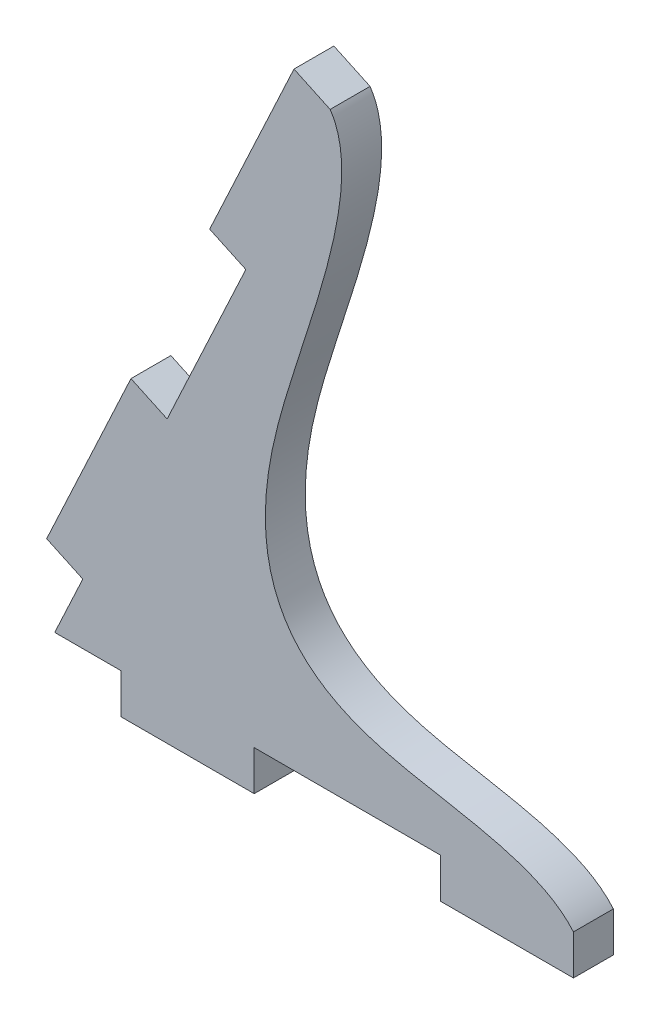
ISO-10303-21;
HEADER;
FILE_DESCRIPTION(('STEP AP214'),'2;1');
FILE_NAME('part.step','',(''),(''),'','','');
FILE_SCHEMA(('AUTOMOTIVE_DESIGN { 1 0 10303 214 1 1 1 1 }'));
ENDSEC;
DATA;
#1=APPLICATION_CONTEXT('core data for automotive mechanical design processes');
#2=APPLICATION_PROTOCOL_DEFINITION('international standard','automotive_design',2000,#1);
#3=PRODUCT_CONTEXT('',#1,'mechanical');
#4=PRODUCT('Part','Part','',(#3));
#5=PRODUCT_RELATED_PRODUCT_CATEGORY('part','',(#4));
#6=PRODUCT_DEFINITION_FORMATION('','',#4);
#7=PRODUCT_DEFINITION_CONTEXT('part definition',#1,'design');
#8=PRODUCT_DEFINITION('design','',#6,#7);
#9=PRODUCT_DEFINITION_SHAPE('','',#8);
#10=(LENGTH_UNIT() NAMED_UNIT(*) SI_UNIT(.MILLI.,.METRE.));
#11=(NAMED_UNIT(*) PLANE_ANGLE_UNIT() SI_UNIT($,.RADIAN.));
#12=(NAMED_UNIT(*) SI_UNIT($,.STERADIAN.) SOLID_ANGLE_UNIT());
#13=UNCERTAINTY_MEASURE_WITH_UNIT(LENGTH_MEASURE(1.E-05),#10,'distance_accuracy_value','');
#14=(GEOMETRIC_REPRESENTATION_CONTEXT(3) GLOBAL_UNCERTAINTY_ASSIGNED_CONTEXT((#13)) GLOBAL_UNIT_ASSIGNED_CONTEXT((#10,
#11,#12)) REPRESENTATION_CONTEXT('',''));
#15=CARTESIAN_POINT('',(0.,0.,0.));
#16=DIRECTION('',(0.,0.,1.));
#17=DIRECTION('',(1.,0.,0.));
#18=AXIS2_PLACEMENT_3D('',#15,#16,#17);
#19=CARTESIAN_POINT('',(0.,0.,3.));
#20=DIRECTION('',(0.,-1.,0.));
#21=DIRECTION('',(1.,0.,0.));
#22=AXIS2_PLACEMENT_3D('',#19,#20,#21);
#23=PLANE('',#22);
#24=DIRECTION('',(-1.,0.,0.));
#25=VECTOR('',#24,1.);
#26=CARTESIAN_POINT('',(0.,0.,0.));
#27=LINE('',#26,#25);
#28=CARTESIAN_POINT('',(29.,0.,0.));
#29=VERTEX_POINT('',#28);
#30=CARTESIAN_POINT('',(15.,0.,0.));
#31=VERTEX_POINT('',#30);
#32=EDGE_CURVE('E182',#29,#31,#27,.T.);
#33=ORIENTED_EDGE('',*,*,#32,.F.);
#34=DIRECTION('',(0.,0.,-1.));
#35=VECTOR('',#34,1.);
#36=CARTESIAN_POINT('',(29.,0.,3.));
#37=LINE('',#36,#35);
#38=CARTESIAN_POINT('',(29.,0.,3.));
#39=VERTEX_POINT('',#38);
#40=EDGE_CURVE('E11',#39,#29,#37,.T.);
#41=ORIENTED_EDGE('',*,*,#40,.F.);
#42=DIRECTION('',(-1.,0.,0.));
#43=VECTOR('',#42,1.);
#44=CARTESIAN_POINT('',(0.,0.,3.));
#45=LINE('',#44,#43);
#46=CARTESIAN_POINT('',(15.,0.,3.));
#47=VERTEX_POINT('',#46);
#48=EDGE_CURVE('E227',#39,#47,#45,.T.);
#49=ORIENTED_EDGE('',*,*,#48,.T.);
#50=DIRECTION('',(0.,0.,-1.));
#51=VECTOR('',#50,1.);
#52=CARTESIAN_POINT('',(15.,0.,3.));
#53=LINE('',#52,#51);
#54=EDGE_CURVE('E51',#47,#31,#53,.T.);
#55=ORIENTED_EDGE('',*,*,#54,.T.);
#56=EDGE_LOOP('',(#33,#41,#49,#55));
#57=FACE_BOUND('',#56,.T.);
#58=ADVANCED_FACE('F34',(#57),#23,.T.);
#59=CARTESIAN_POINT('',(29.,0.,3.));
#60=DIRECTION('',(1.,0.,0.));
#61=DIRECTION('',(0.,0.,-1.));
#62=AXIS2_PLACEMENT_3D('',#59,#60,#61);
#63=PLANE('',#62);
#64=DIRECTION('',(0.,-1.,0.));
#65=VECTOR('',#64,1.);
#66=CARTESIAN_POINT('',(29.,0.,0.));
#67=LINE('',#66,#65);
#68=CARTESIAN_POINT('',(29.,-3.,0.));
#69=VERTEX_POINT('',#68);
#70=EDGE_CURVE('E184',#29,#69,#67,.T.);
#71=ORIENTED_EDGE('',*,*,#70,.T.);
#72=DIRECTION('',(0.,0.,-1.));
#73=VECTOR('',#72,1.);
#74=CARTESIAN_POINT('',(29.,-3.,3.));
#75=LINE('',#74,#73);
#76=CARTESIAN_POINT('',(29.,-3.,3.));
#77=VERTEX_POINT('',#76);
#78=EDGE_CURVE('E43',#77,#69,#75,.T.);
#79=ORIENTED_EDGE('',*,*,#78,.F.);
#80=DIRECTION('',(0.,-1.,0.));
#81=VECTOR('',#80,1.);
#82=CARTESIAN_POINT('',(29.,0.,3.));
#83=LINE('',#82,#81);
#84=EDGE_CURVE('E275',#39,#77,#83,.T.);
#85=ORIENTED_EDGE('',*,*,#84,.F.);
#86=ORIENTED_EDGE('',*,*,#40,.T.);
#87=EDGE_LOOP('',(#71,#79,#85,#86));
#88=FACE_BOUND('',#87,.T.);
#89=ADVANCED_FACE('F36',(#88),#63,.F.);
#90=CARTESIAN_POINT('',(0.,-3.00000000000001,3.));
#91=DIRECTION('',(0.,-1.,0.));
#92=DIRECTION('',(1.,0.,0.));
#93=AXIS2_PLACEMENT_3D('',#90,#91,#92);
#94=PLANE('',#93);
#95=DIRECTION('',(-1.,0.,0.));
#96=VECTOR('',#95,1.);
#97=CARTESIAN_POINT('',(0.,-3.00000000000001,0.));
#98=LINE('',#97,#96);
#99=CARTESIAN_POINT('',(39.,-3.,0.));
#100=VERTEX_POINT('',#99);
#101=EDGE_CURVE('E188',#100,#69,#98,.T.);
#102=ORIENTED_EDGE('',*,*,#101,.F.);
#103=DIRECTION('',(0.,0.,-1.));
#104=VECTOR('',#103,1.);
#105=CARTESIAN_POINT('',(39.,-3.,3.));
#106=LINE('',#105,#104);
#107=CARTESIAN_POINT('',(39.,-3.,3.));
#108=VERTEX_POINT('',#107);
#109=EDGE_CURVE('E254',#108,#100,#106,.T.);
#110=ORIENTED_EDGE('',*,*,#109,.F.);
#111=DIRECTION('',(-1.,0.,0.));
#112=VECTOR('',#111,1.);
#113=CARTESIAN_POINT('',(0.,-3.00000000000001,3.));
#114=LINE('',#113,#112);
#115=EDGE_CURVE('E261',#108,#77,#114,.T.);
#116=ORIENTED_EDGE('',*,*,#115,.T.);
#117=ORIENTED_EDGE('',*,*,#78,.T.);
#118=EDGE_LOOP('',(#102,#110,#116,#117));
#119=FACE_BOUND('',#118,.T.);
#120=ADVANCED_FACE('F259',(#119),#94,.T.);
#121=CARTESIAN_POINT('',(39.,0.,3.));
#122=DIRECTION('',(1.,0.,0.));
#123=DIRECTION('',(0.,0.,-1.));
#124=AXIS2_PLACEMENT_3D('',#121,#122,#123);
#125=PLANE('',#124);
#126=DIRECTION('',(0.,-1.,0.));
#127=VECTOR('',#126,1.);
#128=CARTESIAN_POINT('',(39.,0.,0.));
#129=LINE('',#128,#127);
#130=CARTESIAN_POINT('',(39.,0.,0.));
#131=VERTEX_POINT('',#130);
#132=EDGE_CURVE('E191',#131,#100,#129,.T.);
#133=ORIENTED_EDGE('',*,*,#132,.F.);
#134=DIRECTION('',(0.,0.,-1.));
#135=VECTOR('',#134,1.);
#136=CARTESIAN_POINT('',(39.,0.,3.));
#137=LINE('',#136,#135);
#138=CARTESIAN_POINT('',(39.,0.,3.));
#139=VERTEX_POINT('',#138);
#140=EDGE_CURVE('E252',#139,#131,#137,.T.);
#141=ORIENTED_EDGE('',*,*,#140,.F.);
#142=DIRECTION('',(0.,-1.,0.));
#143=VECTOR('',#142,1.);
#144=CARTESIAN_POINT('',(39.,0.,3.));
#145=LINE('',#144,#143);
#146=EDGE_CURVE('E274',#139,#108,#145,.T.);
#147=ORIENTED_EDGE('',*,*,#146,.T.);
#148=ORIENTED_EDGE('',*,*,#109,.T.);
#149=EDGE_LOOP('',(#133,#141,#147,#148));
#150=FACE_BOUND('',#149,.T.);
#151=ADVANCED_FACE('F270',(#150),#125,.T.);
#152=CARTESIAN_POINT('',(39.,0.,3.));
#153=CARTESIAN_POINT('',(36.4021413195869,3.0880226090273,3.));
#154=CARTESIAN_POINT('',(28.2160980568506,3.51534273018984,3.));
#155=CARTESIAN_POINT('',(17.8173415493479,6.88339723514168,3.));
#156=CARTESIAN_POINT('',(14.4643975142389,12.4948591868415,3.));
#157=CARTESIAN_POINT('',(18.1111991055379,27.5080133750663,3.));
#158=CARTESIAN_POINT('',(23.3616026115048,40.5642627043672,3.));
#159=CARTESIAN_POINT('',(20.7082948252942,44.4090815647959,3.));
#160=B_SPLINE_CURVE_WITH_KNOTS('',3,(#152,#153,#154,#155,#156,#157,#158,#159),.UNSPECIFIED.,.F.,
.F.,(4,1,1,1,1,4),(0.,0.279353687679378,0.353115642968837,0.694896896236175,0.763857597605133,
1.),.UNSPECIFIED.);
#161=DIRECTION('',(0.,0.,-1.));
#162=VECTOR('',#161,1.);
#163=SURFACE_OF_LINEAR_EXTRUSION('',#160,#162);
#164=CARTESIAN_POINT('',(39.,0.,0.));
#165=CARTESIAN_POINT('',(36.4021413195869,3.0880226090273,0.));
#166=CARTESIAN_POINT('',(28.2160980568506,3.51534273018984,0.));
#167=CARTESIAN_POINT('',(17.8173415493479,6.88339723514168,0.));
#168=CARTESIAN_POINT('',(14.4643975142389,12.4948591868415,0.));
#169=CARTESIAN_POINT('',(18.1111991055379,27.5080133750663,0.));
#170=CARTESIAN_POINT('',(23.3616026115048,40.5642627043672,0.));
#171=CARTESIAN_POINT('',(20.7082948252942,44.4090815647959,0.));
#172=B_SPLINE_CURVE_WITH_KNOTS('',3,(#164,#165,#166,#167,#168,#169,#170,#171),.UNSPECIFIED.,.F.,
.F.,(4,1,1,1,1,4),(0.,0.279353687679378,0.353115642968837,0.694896896236175,0.763857597605133,
1.),.UNSPECIFIED.);
#173=CARTESIAN_POINT('',(20.7082948252942,44.4090815647959,0.));
#174=VERTEX_POINT('',#173);
#175=EDGE_CURVE('E194',#131,#174,#172,.T.);
#176=ORIENTED_EDGE('',*,*,#175,.T.);
#177=DIRECTION('',(0.,0.,-1.));
#178=VECTOR('',#177,1.);
#179=CARTESIAN_POINT('',(20.7082948252942,44.4090815647959,3.));
#180=LINE('',#179,#178);
#181=CARTESIAN_POINT('',(20.7082948252942,44.4090815647959,3.));
#182=VERTEX_POINT('',#181);
#183=EDGE_CURVE('E249',#182,#174,#180,.T.);
#184=ORIENTED_EDGE('',*,*,#183,.F.);
#185=EDGE_CURVE('E277',#139,#182,#160,.T.);
#186=ORIENTED_EDGE('',*,*,#185,.F.);
#187=ORIENTED_EDGE('',*,*,#140,.T.);
#188=EDGE_LOOP('',(#176,#184,#186,#187));
#189=FACE_BOUND('',#188,.T.);
#190=ADVANCED_FACE('F292',(#189),#163,.F.);
#191=CARTESIAN_POINT('',(20.7082948252942,44.4090815647959,3.));
#192=DIRECTION('',(-0.422618261740698,-0.906307787036651,0.));
#193=DIRECTION('',(0.906307787036651,-0.422618261740698,0.));
#194=AXIS2_PLACEMENT_3D('',#191,#192,#193);
#195=PLANE('',#194);
#196=DIRECTION('',(-0.906307787036651,0.422618261740698,0.));
#197=VECTOR('',#196,1.);
#198=CARTESIAN_POINT('',(20.7082948252942,44.4090815647959,0.));
#199=LINE('',#198,#197);
#200=CARTESIAN_POINT('',(17.9893714641842,45.676936350018,0.));
#201=VERTEX_POINT('',#200);
#202=EDGE_CURVE('E198',#174,#201,#199,.T.);
#203=ORIENTED_EDGE('',*,*,#202,.T.);
#204=DIRECTION('',(0.,0.,-1.));
#205=VECTOR('',#204,1.);
#206=CARTESIAN_POINT('',(17.9893714641842,45.676936350018,3.));
#207=LINE('',#206,#205);
#208=CARTESIAN_POINT('',(17.9893714641842,45.676936350018,3.));
#209=VERTEX_POINT('',#208);
#210=EDGE_CURVE('E246',#209,#201,#207,.T.);
#211=ORIENTED_EDGE('',*,*,#210,.F.);
#212=DIRECTION('',(-0.906307787036651,0.422618261740698,0.));
#213=VECTOR('',#212,1.);
#214=CARTESIAN_POINT('',(20.7082948252942,44.4090815647959,3.));
#215=LINE('',#214,#213);
#216=EDGE_CURVE('E286',#182,#209,#215,.T.);
#217=ORIENTED_EDGE('',*,*,#216,.F.);
#218=ORIENTED_EDGE('',*,*,#183,.T.);
#219=EDGE_LOOP('',(#203,#211,#217,#218));
#220=FACE_BOUND('',#219,.T.);
#221=ADVANCED_FACE('F296',(#220),#195,.F.);
#222=CARTESIAN_POINT('',(-2.71892336110996,1.26785478522209,3.));
#223=DIRECTION('',(0.906307787036651,-0.422618261740697,0.));
#224=DIRECTION('',(0.422618261740697,0.906307787036651,0.));
#225=AXIS2_PLACEMENT_3D('',#222,#223,#224);
#226=PLANE('',#225);
#227=DIRECTION('',(-0.422618261740697,-0.906307787036651,0.));
#228=VECTOR('',#227,1.);
#229=CARTESIAN_POINT('',(-2.71892336110996,1.26785478522209,0.));
#230=LINE('',#229,#228);
#231=CARTESIAN_POINT('',(11.6500975380737,32.0823195444682,0.));
#232=VERTEX_POINT('',#231);
#233=EDGE_CURVE('E203',#201,#232,#230,.T.);
#234=ORIENTED_EDGE('',*,*,#233,.T.);
#235=DIRECTION('',(0.,0.,-1.));
#236=VECTOR('',#235,1.);
#237=CARTESIAN_POINT('',(11.6500975380737,32.0823195444682,3.));
#238=LINE('',#237,#236);
#239=CARTESIAN_POINT('',(11.6500975380737,32.0823195444682,3.));
#240=VERTEX_POINT('',#239);
#241=EDGE_CURVE('E244',#240,#232,#238,.T.);
#242=ORIENTED_EDGE('',*,*,#241,.F.);
#243=DIRECTION('',(-0.422618261740697,-0.906307787036651,0.));
#244=VECTOR('',#243,1.);
#245=CARTESIAN_POINT('',(-2.71892336110996,1.26785478522209,3.));
#246=LINE('',#245,#244);
#247=EDGE_CURVE('E360',#209,#240,#246,.T.);
#248=ORIENTED_EDGE('',*,*,#247,.F.);
#249=ORIENTED_EDGE('',*,*,#210,.T.);
#250=EDGE_LOOP('',(#234,#242,#248,#249));
#251=FACE_BOUND('',#250,.T.);
#252=ADVANCED_FACE('F357',(#251),#226,.F.);
#253=CARTESIAN_POINT('',(14.3690208991837,30.8144647592461,3.));
#254=DIRECTION('',(-0.422618261740697,-0.906307787036651,0.));
#255=DIRECTION('',(0.906307787036651,-0.422618261740697,0.));
#256=AXIS2_PLACEMENT_3D('',#253,#254,#255);
#257=PLANE('',#256);
#258=DIRECTION('',(-0.906307787036651,0.422618261740697,0.));
#259=VECTOR('',#258,1.);
#260=CARTESIAN_POINT('',(14.3690208991837,30.8144647592461,0.));
#261=LINE('',#260,#259);
#262=CARTESIAN_POINT('',(14.3690208991837,30.8144647592462,0.));
#263=VERTEX_POINT('',#262);
#264=EDGE_CURVE('E206',#263,#232,#261,.T.);
#265=ORIENTED_EDGE('',*,*,#264,.F.);
#266=DIRECTION('',(0.,0.,-1.));
#267=VECTOR('',#266,1.);
#268=CARTESIAN_POINT('',(14.3690208991837,30.8144647592462,3.));
#269=LINE('',#268,#267);
#270=CARTESIAN_POINT('',(14.3690208991837,30.8144647592462,3.));
#271=VERTEX_POINT('',#270);
#272=EDGE_CURVE('E242',#271,#263,#269,.T.);
#273=ORIENTED_EDGE('',*,*,#272,.F.);
#274=DIRECTION('',(-0.906307787036651,0.422618261740697,0.));
#275=VECTOR('',#274,1.);
#276=CARTESIAN_POINT('',(14.3690208991837,30.8144647592461,3.));
#277=LINE('',#276,#275);
#278=EDGE_CURVE('E353',#271,#240,#277,.T.);
#279=ORIENTED_EDGE('',*,*,#278,.T.);
#280=ORIENTED_EDGE('',*,*,#241,.T.);
#281=EDGE_LOOP('',(#265,#273,#279,#280));
#282=FACE_BOUND('',#281,.T.);
#283=ADVANCED_FACE('F352',(#282),#257,.T.);
#284=CARTESIAN_POINT('',(0.,0.,3.));
#285=DIRECTION('',(0.906307787036651,-0.422618261740697,0.));
#286=DIRECTION('',(0.422618261740697,0.906307787036651,0.));
#287=AXIS2_PLACEMENT_3D('',#284,#285,#286);
#288=PLANE('',#287);
#289=DIRECTION('',(-0.422618261740697,-0.906307787036651,0.));
#290=VECTOR('',#289,1.);
#291=CARTESIAN_POINT('',(0.,0.,0.));
#292=LINE('',#291,#290);
#293=CARTESIAN_POINT('',(8.45236523481395,18.126155740733,0.));
#294=VERTEX_POINT('',#293);
#295=EDGE_CURVE('E209',#263,#294,#292,.T.);
#296=ORIENTED_EDGE('',*,*,#295,.T.);
#297=DIRECTION('',(0.,0.,-1.));
#298=VECTOR('',#297,1.);
#299=CARTESIAN_POINT('',(8.45236523481395,18.126155740733,3.));
#300=LINE('',#299,#298);
#301=CARTESIAN_POINT('',(8.45236523481395,18.126155740733,3.));
#302=VERTEX_POINT('',#301);
#303=EDGE_CURVE('E239',#302,#294,#300,.T.);
#304=ORIENTED_EDGE('',*,*,#303,.F.);
#305=DIRECTION('',(-0.422618261740697,-0.906307787036651,0.));
#306=VECTOR('',#305,1.);
#307=CARTESIAN_POINT('',(0.,0.,3.));
#308=LINE('',#307,#306);
#309=EDGE_CURVE('E348',#271,#302,#308,.T.);
#310=ORIENTED_EDGE('',*,*,#309,.F.);
#311=ORIENTED_EDGE('',*,*,#272,.T.);
#312=EDGE_LOOP('',(#296,#304,#310,#311));
#313=FACE_BOUND('',#312,.T.);
#314=ADVANCED_FACE('F320',(#313),#288,.F.);
#315=CARTESIAN_POINT('',(8.45236523481392,18.126155740733,3.));
#316=DIRECTION('',(-0.422618261740696,-0.906307787036651,0.));
#317=DIRECTION('',(0.906307787036652,-0.422618261740696,0.));
#318=AXIS2_PLACEMENT_3D('',#315,#316,#317);
#319=PLANE('',#318);
#320=DIRECTION('',(-0.906307787036652,0.422618261740696,0.));
#321=VECTOR('',#320,1.);
#322=CARTESIAN_POINT('',(8.45236523481392,18.126155740733,0.));
#323=LINE('',#322,#321);
#324=CARTESIAN_POINT('',(5.733441873704,19.3940105259551,0.));
#325=VERTEX_POINT('',#324);
#326=EDGE_CURVE('E211',#294,#325,#323,.T.);
#327=ORIENTED_EDGE('',*,*,#326,.T.);
#328=DIRECTION('',(0.,0.,-1.));
#329=VECTOR('',#328,1.);
#330=CARTESIAN_POINT('',(5.733441873704,19.3940105259551,3.));
#331=LINE('',#330,#329);
#332=CARTESIAN_POINT('',(5.733441873704,19.3940105259551,3.));
#333=VERTEX_POINT('',#332);
#334=EDGE_CURVE('E237',#333,#325,#331,.T.);
#335=ORIENTED_EDGE('',*,*,#334,.F.);
#336=DIRECTION('',(-0.906307787036652,0.422618261740696,0.));
#337=VECTOR('',#336,1.);
#338=CARTESIAN_POINT('',(8.45236523481392,18.126155740733,3.));
#339=LINE('',#338,#337);
#340=EDGE_CURVE('E345',#302,#333,#339,.T.);
#341=ORIENTED_EDGE('',*,*,#340,.F.);
#342=ORIENTED_EDGE('',*,*,#303,.T.);
#343=EDGE_LOOP('',(#327,#335,#341,#342));
#344=FACE_BOUND('',#343,.T.);
#345=ADVANCED_FACE('F342',(#344),#319,.F.);
#346=CARTESIAN_POINT('',(-2.71892336110994,1.26785478522209,3.));
#347=DIRECTION('',(-0.906307787036651,0.422618261740697,0.));
#348=DIRECTION('',(-0.422618261740697,-0.906307787036651,0.));
#349=AXIS2_PLACEMENT_3D('',#346,#347,#348);
#350=PLANE('',#349);
#351=DIRECTION('',(0.422618261740697,0.906307787036651,0.));
#352=VECTOR('',#351,1.);
#353=CARTESIAN_POINT('',(-2.71892336110994,1.26785478522209,0.));
#354=LINE('',#353,#352);
#355=CARTESIAN_POINT('',(-0.605832052406457,5.79939372040534,0.));
#356=VERTEX_POINT('',#355);
#357=EDGE_CURVE('E215',#356,#325,#354,.T.);
#358=ORIENTED_EDGE('',*,*,#357,.F.);
#359=DIRECTION('',(0.,0.,-1.));
#360=VECTOR('',#359,1.);
#361=CARTESIAN_POINT('',(-0.605832052406457,5.79939372040534,3.));
#362=LINE('',#361,#360);
#363=CARTESIAN_POINT('',(-0.605832052406457,5.79939372040534,3.));
#364=VERTEX_POINT('',#363);
#365=EDGE_CURVE('E235',#364,#356,#362,.T.);
#366=ORIENTED_EDGE('',*,*,#365,.F.);
#367=DIRECTION('',(0.422618261740697,0.906307787036651,0.));
#368=VECTOR('',#367,1.);
#369=CARTESIAN_POINT('',(-2.71892336110994,1.26785478522209,3.));
#370=LINE('',#369,#368);
#371=EDGE_CURVE('E369',#364,#333,#370,.T.);
#372=ORIENTED_EDGE('',*,*,#371,.T.);
#373=ORIENTED_EDGE('',*,*,#334,.T.);
#374=EDGE_LOOP('',(#358,#366,#372,#373));
#375=FACE_BOUND('',#374,.T.);
#376=ADVANCED_FACE('F336',(#375),#350,.T.);
#377=CARTESIAN_POINT('',(2.11309130870348,4.53153893518326,3.));
#378=DIRECTION('',(-0.422618261740697,-0.906307787036651,0.));
#379=DIRECTION('',(0.906307787036651,-0.422618261740697,0.));
#380=AXIS2_PLACEMENT_3D('',#377,#378,#379);
#381=PLANE('',#380);
#382=DIRECTION('',(-0.906307787036651,0.422618261740697,0.));
#383=VECTOR('',#382,1.);
#384=CARTESIAN_POINT('',(2.11309130870348,4.53153893518326,0.));
#385=LINE('',#384,#383);
#386=CARTESIAN_POINT('',(2.11309130870349,4.53153893518326,0.));
#387=VERTEX_POINT('',#386);
#388=EDGE_CURVE('E218',#387,#356,#385,.T.);
#389=ORIENTED_EDGE('',*,*,#388,.F.);
#390=DIRECTION('',(0.,0.,-1.));
#391=VECTOR('',#390,1.);
#392=CARTESIAN_POINT('',(2.11309130870349,4.53153893518326,3.));
#393=LINE('',#392,#391);
#394=CARTESIAN_POINT('',(2.11309130870349,4.53153893518326,3.));
#395=VERTEX_POINT('',#394);
#396=EDGE_CURVE('E233',#395,#387,#393,.T.);
#397=ORIENTED_EDGE('',*,*,#396,.F.);
#398=DIRECTION('',(-0.906307787036651,0.422618261740697,0.));
#399=VECTOR('',#398,1.);
#400=CARTESIAN_POINT('',(2.11309130870348,4.53153893518326,3.));
#401=LINE('',#400,#399);
#402=EDGE_CURVE('E332',#395,#364,#401,.T.);
#403=ORIENTED_EDGE('',*,*,#402,.T.);
#404=ORIENTED_EDGE('',*,*,#365,.T.);
#405=EDGE_LOOP('',(#389,#397,#403,#404));
#406=FACE_BOUND('',#405,.T.);
#407=ADVANCED_FACE('F318',(#406),#381,.T.);
#408=CARTESIAN_POINT('',(0.,0.,0.));
#409=VERTEX_POINT('',#408);
#410=EDGE_CURVE('E212',#387,#409,#292,.T.);
#411=ORIENTED_EDGE('',*,*,#410,.T.);
#412=DIRECTION('',(0.,0.,-1.));
#413=VECTOR('',#412,1.);
#414=CARTESIAN_POINT('',(0.,0.,3.));
#415=LINE('',#414,#413);
#416=CARTESIAN_POINT('',(0.,0.,3.));
#417=VERTEX_POINT('',#416);
#418=EDGE_CURVE('E231',#417,#409,#415,.T.);
#419=ORIENTED_EDGE('',*,*,#418,.F.);
#420=EDGE_CURVE('E367',#395,#417,#308,.T.);
#421=ORIENTED_EDGE('',*,*,#420,.F.);
#422=ORIENTED_EDGE('',*,*,#396,.T.);
#423=EDGE_LOOP('',(#411,#419,#421,#422));
#424=FACE_BOUND('',#423,.T.);
#425=ADVANCED_FACE('F312',(#424),#288,.F.);
#426=CARTESIAN_POINT('',(5.,0.,0.));
#427=VERTEX_POINT('',#426);
#428=EDGE_CURVE('E185',#427,#409,#27,.T.);
#429=ORIENTED_EDGE('',*,*,#428,.F.);
#430=DIRECTION('',(0.,0.,-1.));
#431=VECTOR('',#430,1.);
#432=CARTESIAN_POINT('',(5.,0.,3.));
#433=LINE('',#432,#431);
#434=CARTESIAN_POINT('',(5.,0.,3.));
#435=VERTEX_POINT('',#434);
#436=EDGE_CURVE('E174',#435,#427,#433,.T.);
#437=ORIENTED_EDGE('',*,*,#436,.F.);
#438=EDGE_CURVE('E164',#435,#417,#45,.T.);
#439=ORIENTED_EDGE('',*,*,#438,.T.);
#440=ORIENTED_EDGE('',*,*,#418,.T.);
#441=EDGE_LOOP('',(#429,#437,#439,#440));
#442=FACE_BOUND('',#441,.T.);
#443=ADVANCED_FACE('F306',(#442),#23,.T.);
#444=CARTESIAN_POINT('',(5.,0.,3.));
#445=DIRECTION('',(1.,0.,0.));
#446=DIRECTION('',(0.,1.,0.));
#447=AXIS2_PLACEMENT_3D('',#444,#445,#446);
#448=PLANE('',#447);
#449=DIRECTION('',(0.,-1.,0.));
#450=VECTOR('',#449,1.);
#451=CARTESIAN_POINT('',(5.,0.,0.));
#452=LINE('',#451,#450);
#453=CARTESIAN_POINT('',(5.,-3.,0.));
#454=VERTEX_POINT('',#453);
#455=EDGE_CURVE('E171',#427,#454,#452,.T.);
#456=ORIENTED_EDGE('',*,*,#455,.T.);
#457=DIRECTION('',(0.,0.,-1.));
#458=VECTOR('',#457,1.);
#459=CARTESIAN_POINT('',(5.,-3.,3.));
#460=LINE('',#459,#458);
#461=CARTESIAN_POINT('',(5.,-3.,3.));
#462=VERTEX_POINT('',#461);
#463=EDGE_CURVE('E168',#462,#454,#460,.T.);
#464=ORIENTED_EDGE('',*,*,#463,.F.);
#465=DIRECTION('',(0.,-1.,0.));
#466=VECTOR('',#465,1.);
#467=CARTESIAN_POINT('',(5.,0.,3.));
#468=LINE('',#467,#466);
#469=EDGE_CURVE('E156',#435,#462,#468,.T.);
#470=ORIENTED_EDGE('',*,*,#469,.F.);
#471=ORIENTED_EDGE('',*,*,#436,.T.);
#472=EDGE_LOOP('',(#456,#464,#470,#471));
#473=FACE_BOUND('',#472,.T.);
#474=ADVANCED_FACE('F169',(#473),#448,.F.);
#475=CARTESIAN_POINT('',(0.,-3.,3.));
#476=DIRECTION('',(0.,1.,0.));
#477=DIRECTION('',(0.,0.,1.));
#478=AXIS2_PLACEMENT_3D('',#475,#476,#477);
#479=PLANE('',#478);
#480=DIRECTION('',(1.,0.,0.));
#481=VECTOR('',#480,1.);
#482=CARTESIAN_POINT('',(0.,-3.,0.));
#483=LINE('',#482,#481);
#484=CARTESIAN_POINT('',(15.,-3.,0.));
#485=VERTEX_POINT('',#484);
#486=EDGE_CURVE('E222',#454,#485,#483,.T.);
#487=ORIENTED_EDGE('',*,*,#486,.T.);
#488=DIRECTION('',(0.,0.,-1.));
#489=VECTOR('',#488,1.);
#490=CARTESIAN_POINT('',(15.,-3.,3.));
#491=LINE('',#490,#489);
#492=CARTESIAN_POINT('',(15.,-3.,3.));
#493=VERTEX_POINT('',#492);
#494=EDGE_CURVE('E104',#493,#485,#491,.T.);
#495=ORIENTED_EDGE('',*,*,#494,.F.);
#496=DIRECTION('',(1.,0.,0.));
#497=VECTOR('',#496,1.);
#498=CARTESIAN_POINT('',(0.,-3.,3.));
#499=LINE('',#498,#497);
#500=EDGE_CURVE('E162',#462,#493,#499,.T.);
#501=ORIENTED_EDGE('',*,*,#500,.F.);
#502=ORIENTED_EDGE('',*,*,#463,.T.);
#503=EDGE_LOOP('',(#487,#495,#501,#502));
#504=FACE_BOUND('',#503,.T.);
#505=ADVANCED_FACE('F176',(#504),#479,.F.);
#506=CARTESIAN_POINT('',(15.,0.,3.));
#507=DIRECTION('',(1.,0.,0.));
#508=DIRECTION('',(0.,0.,-1.));
#509=AXIS2_PLACEMENT_3D('',#506,#507,#508);
#510=PLANE('',#509);
#511=DIRECTION('',(0.,-1.,0.));
#512=VECTOR('',#511,1.);
#513=CARTESIAN_POINT('',(15.,0.,0.));
#514=LINE('',#513,#512);
#515=EDGE_CURVE('E224',#31,#485,#514,.T.);
#516=ORIENTED_EDGE('',*,*,#515,.F.);
#517=ORIENTED_EDGE('',*,*,#54,.F.);
#518=DIRECTION('',(0.,-1.,0.));
#519=VECTOR('',#518,1.);
#520=CARTESIAN_POINT('',(15.,0.,3.));
#521=LINE('',#520,#519);
#522=EDGE_CURVE('E177',#47,#493,#521,.T.);
#523=ORIENTED_EDGE('',*,*,#522,.T.);
#524=ORIENTED_EDGE('',*,*,#494,.T.);
#525=EDGE_LOOP('',(#516,#517,#523,#524));
#526=FACE_BOUND('',#525,.T.);
#527=ADVANCED_FACE('F370',(#526),#510,.T.);
#528=CARTESIAN_POINT('',(0.,0.,3.));
#529=DIRECTION('',(0.,0.,1.));
#530=DIRECTION('',(1.,0.,0.));
#531=AXIS2_PLACEMENT_3D('',#528,#529,#530);
#532=PLANE('',#531);
#533=ORIENTED_EDGE('',*,*,#48,.F.);
#534=ORIENTED_EDGE('',*,*,#84,.T.);
#535=ORIENTED_EDGE('',*,*,#115,.F.);
#536=ORIENTED_EDGE('',*,*,#146,.F.);
#537=ORIENTED_EDGE('',*,*,#185,.T.);
#538=ORIENTED_EDGE('',*,*,#216,.T.);
#539=ORIENTED_EDGE('',*,*,#247,.T.);
#540=ORIENTED_EDGE('',*,*,#278,.F.);
#541=ORIENTED_EDGE('',*,*,#309,.T.);
#542=ORIENTED_EDGE('',*,*,#340,.T.);
#543=ORIENTED_EDGE('',*,*,#371,.F.);
#544=ORIENTED_EDGE('',*,*,#402,.F.);
#545=ORIENTED_EDGE('',*,*,#420,.T.);
#546=ORIENTED_EDGE('',*,*,#438,.F.);
#547=ORIENTED_EDGE('',*,*,#469,.T.);
#548=ORIENTED_EDGE('',*,*,#500,.T.);
#549=ORIENTED_EDGE('',*,*,#522,.F.);
#550=EDGE_LOOP('',(#533,#534,#535,#536,#537,#538,#539,#540,#541,#542,#543,#544,#545,#546,#547,
#548,#549));
#551=FACE_BOUND('',#550,.T.);
#552=ADVANCED_FACE('F159',(#551),#532,.T.);
#553=CARTESIAN_POINT('',(0.,0.,0.));
#554=DIRECTION('',(0.,0.,1.));
#555=DIRECTION('',(1.,0.,0.));
#556=AXIS2_PLACEMENT_3D('',#553,#554,#555);
#557=PLANE('',#556);
#558=ORIENTED_EDGE('',*,*,#32,.T.);
#559=ORIENTED_EDGE('',*,*,#515,.T.);
#560=ORIENTED_EDGE('',*,*,#486,.F.);
#561=ORIENTED_EDGE('',*,*,#455,.F.);
#562=ORIENTED_EDGE('',*,*,#428,.T.);
#563=ORIENTED_EDGE('',*,*,#410,.F.);
#564=ORIENTED_EDGE('',*,*,#388,.T.);
#565=ORIENTED_EDGE('',*,*,#357,.T.);
#566=ORIENTED_EDGE('',*,*,#326,.F.);
#567=ORIENTED_EDGE('',*,*,#295,.F.);
#568=ORIENTED_EDGE('',*,*,#264,.T.);
#569=ORIENTED_EDGE('',*,*,#233,.F.);
#570=ORIENTED_EDGE('',*,*,#202,.F.);
#571=ORIENTED_EDGE('',*,*,#175,.F.);
#572=ORIENTED_EDGE('',*,*,#132,.T.);
#573=ORIENTED_EDGE('',*,*,#101,.T.);
#574=ORIENTED_EDGE('',*,*,#70,.F.);
#575=EDGE_LOOP('',(#558,#559,#560,#561,#562,#563,#564,#565,#566,#567,#568,#569,#570,#571,#572,
#573,#574));
#576=FACE_BOUND('',#575,.T.);
#577=ADVANCED_FACE('F265',(#576),#557,.F.);
#578=CLOSED_SHELL('',(#58,#89,#120,#151,#190,#221,#252,#283,#314,#345,#376,#407,#425,#443,#474,
#505,#527,#552,#577));
#579=MANIFOLD_SOLID_BREP('B2',#578);
#580=ADVANCED_BREP_SHAPE_REPRESENTATION('',(#18,#579),#14);
#581=SHAPE_DEFINITION_REPRESENTATION(#9,#580);
ENDSEC;
END-ISO-10303-21;
